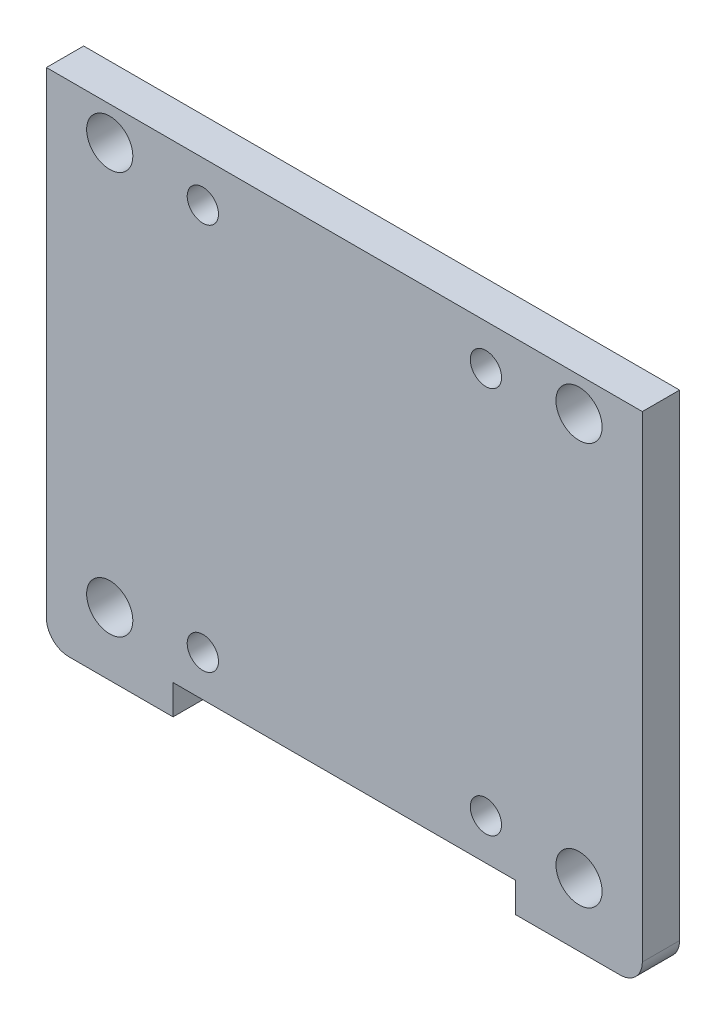
ISO-10303-21;
HEADER;
FILE_DESCRIPTION(('STEP AP214'),'2;1');
FILE_NAME('part.step','',(''),(''),'','','');
FILE_SCHEMA(('AUTOMOTIVE_DESIGN { 1 0 10303 214 1 1 1 1 }'));
ENDSEC;
DATA;
#1=APPLICATION_CONTEXT('core data for automotive mechanical design processes');
#2=APPLICATION_PROTOCOL_DEFINITION('international standard','automotive_design',2000,#1);
#3=PRODUCT_CONTEXT('',#1,'mechanical');
#4=PRODUCT('Part','Part','',(#3));
#5=PRODUCT_RELATED_PRODUCT_CATEGORY('part','',(#4));
#6=PRODUCT_DEFINITION_FORMATION('','',#4);
#7=PRODUCT_DEFINITION_CONTEXT('part definition',#1,'design');
#8=PRODUCT_DEFINITION('design','',#6,#7);
#9=PRODUCT_DEFINITION_SHAPE('','',#8);
#10=(LENGTH_UNIT() NAMED_UNIT(*) SI_UNIT(.MILLI.,.METRE.));
#11=(NAMED_UNIT(*) PLANE_ANGLE_UNIT() SI_UNIT($,.RADIAN.));
#12=(NAMED_UNIT(*) SI_UNIT($,.STERADIAN.) SOLID_ANGLE_UNIT());
#13=UNCERTAINTY_MEASURE_WITH_UNIT(LENGTH_MEASURE(1.E-05),#10,'distance_accuracy_value','');
#14=(GEOMETRIC_REPRESENTATION_CONTEXT(3) GLOBAL_UNCERTAINTY_ASSIGNED_CONTEXT((#13)) GLOBAL_UNIT_ASSIGNED_CONTEXT((#10,
#11,#12)) REPRESENTATION_CONTEXT('',''));
#15=CARTESIAN_POINT('',(0.,0.,0.));
#16=DIRECTION('',(0.,0.,1.));
#17=DIRECTION('',(1.,0.,0.));
#18=AXIS2_PLACEMENT_3D('',#15,#16,#17);
#19=CARTESIAN_POINT('',(-37.,-35.5,5.));
#20=DIRECTION('',(0.,1.,0.));
#21=DIRECTION('',(0.,0.,1.));
#22=AXIS2_PLACEMENT_3D('',#19,#20,#21);
#23=PLANE('',#22);
#24=DIRECTION('',(1.,0.,0.));
#25=VECTOR('',#24,1.);
#26=CARTESIAN_POINT('',(-37.,-35.5,5.));
#27=LINE('',#26,#25);
#28=CARTESIAN_POINT('',(23.,-35.5,5.));
#29=VERTEX_POINT('',#28);
#30=CARTESIAN_POINT('',(37.,-35.5,5.));
#31=VERTEX_POINT('',#30);
#32=EDGE_CURVE('E195',#29,#31,#27,.T.);
#33=ORIENTED_EDGE('',*,*,#32,.F.);
#34=DIRECTION('',(0.,0.,-1.));
#35=VECTOR('',#34,1.);
#36=CARTESIAN_POINT('',(23.,-35.5,5.));
#37=LINE('',#36,#35);
#38=CARTESIAN_POINT('',(23.,-35.5,0.));
#39=VERTEX_POINT('',#38);
#40=EDGE_CURVE('E209',#29,#39,#37,.T.);
#41=ORIENTED_EDGE('',*,*,#40,.T.);
#42=DIRECTION('',(1.,0.,0.));
#43=VECTOR('',#42,1.);
#44=CARTESIAN_POINT('',(-37.,-35.5,0.));
#45=LINE('',#44,#43);
#46=CARTESIAN_POINT('',(37.,-35.5,0.));
#47=VERTEX_POINT('',#46);
#48=EDGE_CURVE('E131',#39,#47,#45,.T.);
#49=ORIENTED_EDGE('',*,*,#48,.T.);
#50=DIRECTION('',(0.,0.,-1.));
#51=VECTOR('',#50,1.);
#52=CARTESIAN_POINT('',(37.,-35.5,5.));
#53=LINE('',#52,#51);
#54=EDGE_CURVE('E146',#31,#47,#53,.T.);
#55=ORIENTED_EDGE('',*,*,#54,.F.);
#56=EDGE_LOOP('',(#33,#41,#49,#55));
#57=FACE_BOUND('',#56,.T.);
#58=ADVANCED_FACE('F34',(#57),#23,.F.);
#59=CARTESIAN_POINT('',(37.,-32.5,5.));
#60=DIRECTION('',(0.,0.,-1.));
#61=DIRECTION('',(-1.,0.,0.));
#62=AXIS2_PLACEMENT_3D('',#59,#60,#61);
#63=CYLINDRICAL_SURFACE('',#62,3.);
#64=CARTESIAN_POINT('',(37.,-32.5,0.));
#65=DIRECTION('',(0.,0.,1.));
#66=DIRECTION('',(1.,0.,0.));
#67=AXIS2_PLACEMENT_3D('',#64,#65,#66);
#68=CIRCLE('',#67,3.);
#69=CARTESIAN_POINT('',(40.,-32.5,0.));
#70=VERTEX_POINT('',#69);
#71=EDGE_CURVE('E133',#47,#70,#68,.T.);
#72=ORIENTED_EDGE('',*,*,#71,.T.);
#73=DIRECTION('',(0.,0.,-1.));
#74=VECTOR('',#73,1.);
#75=CARTESIAN_POINT('',(40.,-32.5,5.));
#76=LINE('',#75,#74);
#77=CARTESIAN_POINT('',(40.,-32.5,5.));
#78=VERTEX_POINT('',#77);
#79=EDGE_CURVE('E42',#78,#70,#76,.T.);
#80=ORIENTED_EDGE('',*,*,#79,.F.);
#81=CARTESIAN_POINT('',(37.,-32.5,5.));
#82=DIRECTION('',(0.,0.,1.));
#83=DIRECTION('',(1.,0.,0.));
#84=AXIS2_PLACEMENT_3D('',#81,#82,#83);
#85=CIRCLE('',#84,3.);
#86=EDGE_CURVE('E141',#31,#78,#85,.T.);
#87=ORIENTED_EDGE('',*,*,#86,.F.);
#88=ORIENTED_EDGE('',*,*,#54,.T.);
#89=EDGE_LOOP('',(#72,#80,#87,#88));
#90=FACE_BOUND('',#89,.T.);
#91=ADVANCED_FACE('F36',(#90),#63,.T.);
#92=CARTESIAN_POINT('',(40.,-32.5,5.));
#93=DIRECTION('',(-1.,0.,0.));
#94=DIRECTION('',(0.,0.,1.));
#95=AXIS2_PLACEMENT_3D('',#92,#93,#94);
#96=PLANE('',#95);
#97=DIRECTION('',(0.,1.,0.));
#98=VECTOR('',#97,1.);
#99=CARTESIAN_POINT('',(40.,-32.5,0.));
#100=LINE('',#99,#98);
#101=CARTESIAN_POINT('',(40.,31.4999999999999,0.));
#102=VERTEX_POINT('',#101);
#103=EDGE_CURVE('E159',#70,#102,#100,.T.);
#104=ORIENTED_EDGE('',*,*,#103,.T.);
#105=DIRECTION('',(0.,0.,1.));
#106=VECTOR('',#105,1.);
#107=CARTESIAN_POINT('',(40.,31.5,0.));
#108=LINE('',#107,#106);
#109=CARTESIAN_POINT('',(40.,31.5,5.));
#110=VERTEX_POINT('',#109);
#111=EDGE_CURVE('E57',#102,#110,#108,.T.);
#112=ORIENTED_EDGE('',*,*,#111,.T.);
#113=DIRECTION('',(0.,1.,0.));
#114=VECTOR('',#113,1.);
#115=CARTESIAN_POINT('',(40.,-32.5,5.));
#116=LINE('',#115,#114);
#117=EDGE_CURVE('E161',#78,#110,#116,.T.);
#118=ORIENTED_EDGE('',*,*,#117,.F.);
#119=ORIENTED_EDGE('',*,*,#79,.T.);
#120=EDGE_LOOP('',(#104,#112,#118,#119));
#121=FACE_BOUND('',#120,.T.);
#122=ADVANCED_FACE('F158',(#121),#96,.F.);
#123=CARTESIAN_POINT('',(-40.,-32.5,5.));
#124=DIRECTION('',(1.,0.,0.));
#125=DIRECTION('',(0.,0.,-1.));
#126=AXIS2_PLACEMENT_3D('',#123,#124,#125);
#127=PLANE('',#126);
#128=DIRECTION('',(0.,-1.,0.));
#129=VECTOR('',#128,1.);
#130=CARTESIAN_POINT('',(-40.,-32.5,5.));
#131=LINE('',#130,#129);
#132=CARTESIAN_POINT('',(-40.,31.5,5.));
#133=VERTEX_POINT('',#132);
#134=CARTESIAN_POINT('',(-40.,-32.5,5.));
#135=VERTEX_POINT('',#134);
#136=EDGE_CURVE('E197',#133,#135,#131,.T.);
#137=ORIENTED_EDGE('',*,*,#136,.F.);
#138=DIRECTION('',(0.,0.,1.));
#139=VECTOR('',#138,1.);
#140=CARTESIAN_POINT('',(-40.,31.5,0.));
#141=LINE('',#140,#139);
#142=CARTESIAN_POINT('',(-40.,31.5,0.));
#143=VERTEX_POINT('',#142);
#144=EDGE_CURVE('E180',#143,#133,#141,.T.);
#145=ORIENTED_EDGE('',*,*,#144,.F.);
#146=DIRECTION('',(0.,-1.,0.));
#147=VECTOR('',#146,1.);
#148=CARTESIAN_POINT('',(-40.,-32.5,0.));
#149=LINE('',#148,#147);
#150=CARTESIAN_POINT('',(-40.,-32.5,0.));
#151=VERTEX_POINT('',#150);
#152=EDGE_CURVE('E142',#143,#151,#149,.T.);
#153=ORIENTED_EDGE('',*,*,#152,.T.);
#154=DIRECTION('',(0.,0.,-1.));
#155=VECTOR('',#154,1.);
#156=CARTESIAN_POINT('',(-40.,-32.5,5.));
#157=LINE('',#156,#155);
#158=EDGE_CURVE('E152',#135,#151,#157,.T.);
#159=ORIENTED_EDGE('',*,*,#158,.F.);
#160=EDGE_LOOP('',(#137,#145,#153,#159));
#161=FACE_BOUND('',#160,.T.);
#162=ADVANCED_FACE('F178',(#161),#127,.F.);
#163=CARTESIAN_POINT('',(-37.,-32.5,5.));
#164=DIRECTION('',(0.,0.,-1.));
#165=DIRECTION('',(-1.,0.,0.));
#166=AXIS2_PLACEMENT_3D('',#163,#164,#165);
#167=CYLINDRICAL_SURFACE('',#166,3.);
#168=CARTESIAN_POINT('',(-37.,-32.5,0.));
#169=DIRECTION('',(0.,0.,1.));
#170=DIRECTION('',(-1.,0.,0.));
#171=AXIS2_PLACEMENT_3D('',#168,#169,#170);
#172=CIRCLE('',#171,3.);
#173=CARTESIAN_POINT('',(-37.,-35.5,0.));
#174=VERTEX_POINT('',#173);
#175=EDGE_CURVE('E138',#151,#174,#172,.T.);
#176=ORIENTED_EDGE('',*,*,#175,.T.);
#177=DIRECTION('',(0.,0.,-1.));
#178=VECTOR('',#177,1.);
#179=CARTESIAN_POINT('',(-37.,-35.5,5.));
#180=LINE('',#179,#178);
#181=CARTESIAN_POINT('',(-37.,-35.5,5.));
#182=VERTEX_POINT('',#181);
#183=EDGE_CURVE('E148',#182,#174,#180,.T.);
#184=ORIENTED_EDGE('',*,*,#183,.F.);
#185=CARTESIAN_POINT('',(-37.,-32.5,5.));
#186=DIRECTION('',(0.,0.,1.));
#187=DIRECTION('',(-1.,0.,0.));
#188=AXIS2_PLACEMENT_3D('',#185,#186,#187);
#189=CIRCLE('',#188,3.);
#190=EDGE_CURVE('E185',#135,#182,#189,.T.);
#191=ORIENTED_EDGE('',*,*,#190,.F.);
#192=ORIENTED_EDGE('',*,*,#158,.T.);
#193=EDGE_LOOP('',(#176,#184,#191,#192));
#194=FACE_BOUND('',#193,.T.);
#195=ADVANCED_FACE('F183',(#194),#167,.T.);
#196=CARTESIAN_POINT('',(-23.,-35.5,0.));
#197=VERTEX_POINT('',#196);
#198=EDGE_CURVE('E137',#174,#197,#45,.T.);
#199=ORIENTED_EDGE('',*,*,#198,.T.);
#200=DIRECTION('',(0.,0.,1.));
#201=VECTOR('',#200,1.);
#202=CARTESIAN_POINT('',(-23.,-35.5,5.));
#203=LINE('',#202,#201);
#204=CARTESIAN_POINT('',(-23.,-35.5,5.));
#205=VERTEX_POINT('',#204);
#206=EDGE_CURVE('E191',#197,#205,#203,.T.);
#207=ORIENTED_EDGE('',*,*,#206,.T.);
#208=EDGE_CURVE('E149',#182,#205,#27,.T.);
#209=ORIENTED_EDGE('',*,*,#208,.F.);
#210=ORIENTED_EDGE('',*,*,#183,.T.);
#211=EDGE_LOOP('',(#199,#207,#209,#210));
#212=FACE_BOUND('',#211,.T.);
#213=ADVANCED_FACE('F189',(#212),#23,.F.);
#214=CARTESIAN_POINT('',(37.,-32.5,5.));
#215=DIRECTION('',(0.,0.,1.));
#216=DIRECTION('',(1.,0.,0.));
#217=AXIS2_PLACEMENT_3D('',#214,#215,#216);
#218=PLANE('',#217);
#219=CARTESIAN_POINT('',(19.,25.9999999999999,5.));
#220=DIRECTION('',(0.,0.,1.));
#221=DIRECTION('',(1.,0.,0.));
#222=AXIS2_PLACEMENT_3D('',#219,#220,#221);
#223=CIRCLE('',#222,2.1);
#224=CARTESIAN_POINT('',(21.1,25.9999999999999,5.));
#225=VERTEX_POINT('',#224);
#226=EDGE_CURVE('E244',#225,#225,#223,.T.);
#227=ORIENTED_EDGE('',*,*,#226,.F.);
#228=EDGE_LOOP('',(#227));
#229=FACE_BOUND('',#228,.T.);
#230=CARTESIAN_POINT('',(-19.,25.9999999999999,5.));
#231=DIRECTION('',(0.,0.,1.));
#232=DIRECTION('',(1.,0.,0.));
#233=AXIS2_PLACEMENT_3D('',#230,#231,#232);
#234=CIRCLE('',#233,2.1);
#235=CARTESIAN_POINT('',(-16.9,25.9999999999999,5.));
#236=VERTEX_POINT('',#235);
#237=EDGE_CURVE('E250',#236,#236,#234,.T.);
#238=ORIENTED_EDGE('',*,*,#237,.F.);
#239=EDGE_LOOP('',(#238));
#240=FACE_BOUND('',#239,.T.);
#241=CARTESIAN_POINT('',(-19.,-26.,5.));
#242=DIRECTION('',(0.,0.,1.));
#243=DIRECTION('',(1.,0.,0.));
#244=AXIS2_PLACEMENT_3D('',#241,#242,#243);
#245=CIRCLE('',#244,2.1);
#246=CARTESIAN_POINT('',(-16.9,-26.,5.));
#247=VERTEX_POINT('',#246);
#248=EDGE_CURVE('E256',#247,#247,#245,.T.);
#249=ORIENTED_EDGE('',*,*,#248,.F.);
#250=EDGE_LOOP('',(#249));
#251=FACE_BOUND('',#250,.T.);
#252=CARTESIAN_POINT('',(19.,-26.,5.));
#253=DIRECTION('',(0.,0.,1.));
#254=DIRECTION('',(1.,0.,0.));
#255=AXIS2_PLACEMENT_3D('',#252,#253,#254);
#256=CIRCLE('',#255,2.1);
#257=CARTESIAN_POINT('',(21.1,-26.,5.));
#258=VERTEX_POINT('',#257);
#259=EDGE_CURVE('E238',#258,#258,#256,.T.);
#260=ORIENTED_EDGE('',*,*,#259,.F.);
#261=EDGE_LOOP('',(#260));
#262=FACE_BOUND('',#261,.T.);
#263=DIRECTION('',(0.,1.,0.));
#264=VECTOR('',#263,1.);
#265=CARTESIAN_POINT('',(23.,-39.5,5.));
#266=LINE('',#265,#264);
#267=CARTESIAN_POINT('',(23.,-31.5,5.));
#268=VERTEX_POINT('',#267);
#269=EDGE_CURVE('E115',#29,#268,#266,.T.);
#270=ORIENTED_EDGE('',*,*,#269,.F.);
#271=ORIENTED_EDGE('',*,*,#32,.T.);
#272=ORIENTED_EDGE('',*,*,#86,.T.);
#273=ORIENTED_EDGE('',*,*,#117,.T.);
#274=DIRECTION('',(1.,0.,0.));
#275=VECTOR('',#274,1.);
#276=CARTESIAN_POINT('',(-40.,31.5,5.));
#277=LINE('',#276,#275);
#278=EDGE_CURVE('E228',#133,#110,#277,.T.);
#279=ORIENTED_EDGE('',*,*,#278,.F.);
#280=ORIENTED_EDGE('',*,*,#136,.T.);
#281=ORIENTED_EDGE('',*,*,#190,.T.);
#282=ORIENTED_EDGE('',*,*,#208,.T.);
#283=DIRECTION('',(0.,-1.,0.));
#284=VECTOR('',#283,1.);
#285=CARTESIAN_POINT('',(-23.,-39.5,5.));
#286=LINE('',#285,#284);
#287=CARTESIAN_POINT('',(-23.,-31.5,5.));
#288=VERTEX_POINT('',#287);
#289=EDGE_CURVE('E125',#288,#205,#286,.T.);
#290=ORIENTED_EDGE('',*,*,#289,.F.);
#291=DIRECTION('',(-1.,0.,0.));
#292=VECTOR('',#291,1.);
#293=CARTESIAN_POINT('',(-23.,-31.5,5.));
#294=LINE('',#293,#292);
#295=EDGE_CURVE('E234',#268,#288,#294,.T.);
#296=ORIENTED_EDGE('',*,*,#295,.F.);
#297=EDGE_LOOP('',(#270,#271,#272,#273,#279,#280,#281,#282,#290,#296));
#298=FACE_BOUND('',#297,.T.);
#299=CARTESIAN_POINT('',(-31.5,-27.,5.));
#300=DIRECTION('',(0.,0.,1.));
#301=DIRECTION('',(1.,0.,0.));
#302=AXIS2_PLACEMENT_3D('',#299,#300,#301);
#303=CIRCLE('',#302,3.1);
#304=CARTESIAN_POINT('',(-28.4,-27.,5.));
#305=VERTEX_POINT('',#304);
#306=EDGE_CURVE('E205',#305,#305,#303,.T.);
#307=ORIENTED_EDGE('',*,*,#306,.F.);
#308=EDGE_LOOP('',(#307));
#309=FACE_BOUND('',#308,.T.);
#310=CARTESIAN_POINT('',(31.5,-27.,5.));
#311=DIRECTION('',(0.,0.,1.));
#312=DIRECTION('',(1.,0.,0.));
#313=AXIS2_PLACEMENT_3D('',#310,#311,#312);
#314=CIRCLE('',#313,3.1);
#315=CARTESIAN_POINT('',(34.6,-27.,5.));
#316=VERTEX_POINT('',#315);
#317=EDGE_CURVE('E212',#316,#316,#314,.T.);
#318=ORIENTED_EDGE('',*,*,#317,.F.);
#319=EDGE_LOOP('',(#318));
#320=FACE_BOUND('',#319,.T.);
#321=CARTESIAN_POINT('',(31.5,27.,5.));
#322=DIRECTION('',(0.,0.,1.));
#323=DIRECTION('',(1.,0.,0.));
#324=AXIS2_PLACEMENT_3D('',#321,#322,#323);
#325=CIRCLE('',#324,3.1);
#326=CARTESIAN_POINT('',(34.6,27.,5.));
#327=VERTEX_POINT('',#326);
#328=EDGE_CURVE('E218',#327,#327,#325,.T.);
#329=ORIENTED_EDGE('',*,*,#328,.F.);
#330=EDGE_LOOP('',(#329));
#331=FACE_BOUND('',#330,.T.);
#332=CARTESIAN_POINT('',(-31.5,27.,5.));
#333=DIRECTION('',(0.,0.,1.));
#334=DIRECTION('',(1.,0.,0.));
#335=AXIS2_PLACEMENT_3D('',#332,#333,#334);
#336=CIRCLE('',#335,3.1);
#337=CARTESIAN_POINT('',(-28.4,27.,5.));
#338=VERTEX_POINT('',#337);
#339=EDGE_CURVE('E169',#338,#338,#336,.T.);
#340=ORIENTED_EDGE('',*,*,#339,.F.);
#341=EDGE_LOOP('',(#340));
#342=FACE_BOUND('',#341,.T.);
#343=ADVANCED_FACE('F272',(#229,#240,#251,#262,#298,#309,#320,#331,#342),#218,.T.);
#344=CARTESIAN_POINT('',(37.,-32.5,0.));
#345=DIRECTION('',(0.,0.,1.));
#346=DIRECTION('',(1.,0.,0.));
#347=AXIS2_PLACEMENT_3D('',#344,#345,#346);
#348=PLANE('',#347);
#349=CARTESIAN_POINT('',(19.,25.9999999999999,0.));
#350=DIRECTION('',(0.,0.,1.));
#351=DIRECTION('',(1.,0.,0.));
#352=AXIS2_PLACEMENT_3D('',#349,#350,#351);
#353=CIRCLE('',#352,2.1);
#354=CARTESIAN_POINT('',(21.1,25.9999999999999,0.));
#355=VERTEX_POINT('',#354);
#356=EDGE_CURVE('E247',#355,#355,#353,.T.);
#357=ORIENTED_EDGE('',*,*,#356,.T.);
#358=EDGE_LOOP('',(#357));
#359=FACE_BOUND('',#358,.T.);
#360=CARTESIAN_POINT('',(-19.,25.9999999999999,0.));
#361=DIRECTION('',(0.,0.,1.));
#362=DIRECTION('',(1.,0.,0.));
#363=AXIS2_PLACEMENT_3D('',#360,#361,#362);
#364=CIRCLE('',#363,2.1);
#365=CARTESIAN_POINT('',(-16.9,25.9999999999999,0.));
#366=VERTEX_POINT('',#365);
#367=EDGE_CURVE('E253',#366,#366,#364,.T.);
#368=ORIENTED_EDGE('',*,*,#367,.T.);
#369=EDGE_LOOP('',(#368));
#370=FACE_BOUND('',#369,.T.);
#371=CARTESIAN_POINT('',(-19.,-26.,0.));
#372=DIRECTION('',(0.,0.,1.));
#373=DIRECTION('',(1.,0.,0.));
#374=AXIS2_PLACEMENT_3D('',#371,#372,#373);
#375=CIRCLE('',#374,2.1);
#376=CARTESIAN_POINT('',(-16.9,-26.,0.));
#377=VERTEX_POINT('',#376);
#378=EDGE_CURVE('E241',#377,#377,#375,.T.);
#379=ORIENTED_EDGE('',*,*,#378,.T.);
#380=EDGE_LOOP('',(#379));
#381=FACE_BOUND('',#380,.T.);
#382=CARTESIAN_POINT('',(19.,-26.,0.));
#383=DIRECTION('',(0.,0.,1.));
#384=DIRECTION('',(1.,0.,0.));
#385=AXIS2_PLACEMENT_3D('',#382,#383,#384);
#386=CIRCLE('',#385,2.1);
#387=CARTESIAN_POINT('',(21.1,-26.,0.));
#388=VERTEX_POINT('',#387);
#389=EDGE_CURVE('E230',#388,#388,#386,.T.);
#390=ORIENTED_EDGE('',*,*,#389,.T.);
#391=EDGE_LOOP('',(#390));
#392=FACE_BOUND('',#391,.T.);
#393=ORIENTED_EDGE('',*,*,#48,.F.);
#394=DIRECTION('',(0.,1.,0.));
#395=VECTOR('',#394,1.);
#396=CARTESIAN_POINT('',(23.,-32.5,0.));
#397=LINE('',#396,#395);
#398=CARTESIAN_POINT('',(23.,-31.5,0.));
#399=VERTEX_POINT('',#398);
#400=EDGE_CURVE('E11',#39,#399,#397,.T.);
#401=ORIENTED_EDGE('',*,*,#400,.T.);
#402=DIRECTION('',(-1.,0.,0.));
#403=VECTOR('',#402,1.);
#404=CARTESIAN_POINT('',(-23.,-31.5,0.));
#405=LINE('',#404,#403);
#406=CARTESIAN_POINT('',(-23.,-31.5,0.));
#407=VERTEX_POINT('',#406);
#408=EDGE_CURVE('E122',#399,#407,#405,.T.);
#409=ORIENTED_EDGE('',*,*,#408,.T.);
#410=DIRECTION('',(0.,-1.,0.));
#411=VECTOR('',#410,1.);
#412=CARTESIAN_POINT('',(-23.,-39.5,0.));
#413=LINE('',#412,#411);
#414=EDGE_CURVE('E49',#407,#197,#413,.T.);
#415=ORIENTED_EDGE('',*,*,#414,.T.);
#416=ORIENTED_EDGE('',*,*,#198,.F.);
#417=ORIENTED_EDGE('',*,*,#175,.F.);
#418=ORIENTED_EDGE('',*,*,#152,.F.);
#419=DIRECTION('',(1.,0.,0.));
#420=VECTOR('',#419,1.);
#421=CARTESIAN_POINT('',(-40.,31.5,0.));
#422=LINE('',#421,#420);
#423=EDGE_CURVE('E226',#143,#102,#422,.T.);
#424=ORIENTED_EDGE('',*,*,#423,.T.);
#425=ORIENTED_EDGE('',*,*,#103,.F.);
#426=ORIENTED_EDGE('',*,*,#71,.F.);
#427=EDGE_LOOP('',(#393,#401,#409,#415,#416,#417,#418,#424,#425,#426));
#428=FACE_BOUND('',#427,.T.);
#429=CARTESIAN_POINT('',(-31.5,-27.,0.));
#430=DIRECTION('',(0.,0.,1.));
#431=DIRECTION('',(1.,0.,0.));
#432=AXIS2_PLACEMENT_3D('',#429,#430,#431);
#433=CIRCLE('',#432,3.1);
#434=CARTESIAN_POINT('',(-28.4,-27.,0.));
#435=VERTEX_POINT('',#434);
#436=EDGE_CURVE('E208',#435,#435,#433,.T.);
#437=ORIENTED_EDGE('',*,*,#436,.T.);
#438=EDGE_LOOP('',(#437));
#439=FACE_BOUND('',#438,.T.);
#440=CARTESIAN_POINT('',(31.5,-27.,0.));
#441=DIRECTION('',(0.,0.,1.));
#442=DIRECTION('',(1.,0.,0.));
#443=AXIS2_PLACEMENT_3D('',#440,#441,#442);
#444=CIRCLE('',#443,3.1);
#445=CARTESIAN_POINT('',(34.6,-27.,0.));
#446=VERTEX_POINT('',#445);
#447=EDGE_CURVE('E215',#446,#446,#444,.T.);
#448=ORIENTED_EDGE('',*,*,#447,.T.);
#449=EDGE_LOOP('',(#448));
#450=FACE_BOUND('',#449,.T.);
#451=CARTESIAN_POINT('',(31.5,27.,0.));
#452=DIRECTION('',(0.,0.,1.));
#453=DIRECTION('',(1.,0.,0.));
#454=AXIS2_PLACEMENT_3D('',#451,#452,#453);
#455=CIRCLE('',#454,3.1);
#456=CARTESIAN_POINT('',(34.6,27.,0.));
#457=VERTEX_POINT('',#456);
#458=EDGE_CURVE('E203',#457,#457,#455,.T.);
#459=ORIENTED_EDGE('',*,*,#458,.T.);
#460=EDGE_LOOP('',(#459));
#461=FACE_BOUND('',#460,.T.);
#462=CARTESIAN_POINT('',(-31.5,27.,0.));
#463=DIRECTION('',(0.,0.,1.));
#464=DIRECTION('',(1.,0.,0.));
#465=AXIS2_PLACEMENT_3D('',#462,#463,#464);
#466=CIRCLE('',#465,3.1);
#467=CARTESIAN_POINT('',(-28.4,27.,0.));
#468=VERTEX_POINT('',#467);
#469=EDGE_CURVE('E165',#468,#468,#466,.T.);
#470=ORIENTED_EDGE('',*,*,#469,.T.);
#471=EDGE_LOOP('',(#470));
#472=FACE_BOUND('',#471,.T.);
#473=ADVANCED_FACE('F128',(#359,#370,#381,#392,#428,#439,#450,#461,#472),#348,.F.);
#474=CARTESIAN_POINT('',(-31.5,27.,0.));
#475=DIRECTION('',(0.,0.,1.));
#476=DIRECTION('',(1.,0.,0.));
#477=AXIS2_PLACEMENT_3D('',#474,#475,#476);
#478=CYLINDRICAL_SURFACE('',#477,3.1);
#479=ORIENTED_EDGE('',*,*,#469,.F.);
#480=EDGE_LOOP('',(#479));
#481=FACE_BOUND('',#480,.T.);
#482=ORIENTED_EDGE('',*,*,#339,.T.);
#483=EDGE_LOOP('',(#482));
#484=FACE_BOUND('',#483,.T.);
#485=ADVANCED_FACE('F287',(#481,#484),#478,.F.);
#486=CARTESIAN_POINT('',(31.5,27.,0.));
#487=DIRECTION('',(0.,0.,1.));
#488=DIRECTION('',(1.,0.,0.));
#489=AXIS2_PLACEMENT_3D('',#486,#487,#488);
#490=CYLINDRICAL_SURFACE('',#489,3.1);
#491=ORIENTED_EDGE('',*,*,#458,.F.);
#492=EDGE_LOOP('',(#491));
#493=FACE_BOUND('',#492,.T.);
#494=ORIENTED_EDGE('',*,*,#328,.T.);
#495=EDGE_LOOP('',(#494));
#496=FACE_BOUND('',#495,.T.);
#497=ADVANCED_FACE('F289',(#493,#496),#490,.F.);
#498=CARTESIAN_POINT('',(31.5,-27.,0.));
#499=DIRECTION('',(0.,0.,1.));
#500=DIRECTION('',(1.,0.,0.));
#501=AXIS2_PLACEMENT_3D('',#498,#499,#500);
#502=CYLINDRICAL_SURFACE('',#501,3.1);
#503=ORIENTED_EDGE('',*,*,#447,.F.);
#504=EDGE_LOOP('',(#503));
#505=FACE_BOUND('',#504,.T.);
#506=ORIENTED_EDGE('',*,*,#317,.T.);
#507=EDGE_LOOP('',(#506));
#508=FACE_BOUND('',#507,.T.);
#509=ADVANCED_FACE('F296',(#505,#508),#502,.F.);
#510=CARTESIAN_POINT('',(-31.5,-27.,0.));
#511=DIRECTION('',(0.,0.,1.));
#512=DIRECTION('',(1.,0.,0.));
#513=AXIS2_PLACEMENT_3D('',#510,#511,#512);
#514=CYLINDRICAL_SURFACE('',#513,3.1);
#515=ORIENTED_EDGE('',*,*,#436,.F.);
#516=EDGE_LOOP('',(#515));
#517=FACE_BOUND('',#516,.T.);
#518=ORIENTED_EDGE('',*,*,#306,.T.);
#519=EDGE_LOOP('',(#518));
#520=FACE_BOUND('',#519,.T.);
#521=ADVANCED_FACE('F342',(#517,#520),#514,.F.);
#522=CARTESIAN_POINT('',(-40.,31.5,0.));
#523=DIRECTION('',(0.,-1.,0.));
#524=DIRECTION('',(0.,0.,-1.));
#525=AXIS2_PLACEMENT_3D('',#522,#523,#524);
#526=PLANE('',#525);
#527=ORIENTED_EDGE('',*,*,#278,.T.);
#528=ORIENTED_EDGE('',*,*,#111,.F.);
#529=ORIENTED_EDGE('',*,*,#423,.F.);
#530=ORIENTED_EDGE('',*,*,#144,.T.);
#531=EDGE_LOOP('',(#527,#528,#529,#530));
#532=FACE_BOUND('',#531,.T.);
#533=ADVANCED_FACE('F337',(#532),#526,.F.);
#534=CARTESIAN_POINT('',(23.,-39.5,0.));
#535=DIRECTION('',(1.,0.,0.));
#536=DIRECTION('',(0.,0.,-1.));
#537=AXIS2_PLACEMENT_3D('',#534,#535,#536);
#538=PLANE('',#537);
#539=ORIENTED_EDGE('',*,*,#269,.T.);
#540=DIRECTION('',(0.,0.,1.));
#541=VECTOR('',#540,1.);
#542=CARTESIAN_POINT('',(23.,-31.5,0.));
#543=LINE('',#542,#541);
#544=EDGE_CURVE('E110',#399,#268,#543,.T.);
#545=ORIENTED_EDGE('',*,*,#544,.F.);
#546=ORIENTED_EDGE('',*,*,#400,.F.);
#547=ORIENTED_EDGE('',*,*,#40,.F.);
#548=EDGE_LOOP('',(#539,#545,#546,#547));
#549=FACE_BOUND('',#548,.T.);
#550=ADVANCED_FACE('F112',(#549),#538,.F.);
#551=CARTESIAN_POINT('',(-23.,-39.5,0.));
#552=DIRECTION('',(-1.,0.,0.));
#553=DIRECTION('',(0.,0.,1.));
#554=AXIS2_PLACEMENT_3D('',#551,#552,#553);
#555=PLANE('',#554);
#556=ORIENTED_EDGE('',*,*,#414,.F.);
#557=DIRECTION('',(0.,0.,1.));
#558=VECTOR('',#557,1.);
#559=CARTESIAN_POINT('',(-23.,-31.5,0.));
#560=LINE('',#559,#558);
#561=EDGE_CURVE('E119',#407,#288,#560,.T.);
#562=ORIENTED_EDGE('',*,*,#561,.T.);
#563=ORIENTED_EDGE('',*,*,#289,.T.);
#564=ORIENTED_EDGE('',*,*,#206,.F.);
#565=EDGE_LOOP('',(#556,#562,#563,#564));
#566=FACE_BOUND('',#565,.T.);
#567=ADVANCED_FACE('F353',(#566),#555,.F.);
#568=CARTESIAN_POINT('',(-23.,-31.5,0.));
#569=DIRECTION('',(0.,1.,0.));
#570=DIRECTION('',(0.,0.,1.));
#571=AXIS2_PLACEMENT_3D('',#568,#569,#570);
#572=PLANE('',#571);
#573=ORIENTED_EDGE('',*,*,#295,.T.);
#574=ORIENTED_EDGE('',*,*,#561,.F.);
#575=ORIENTED_EDGE('',*,*,#408,.F.);
#576=ORIENTED_EDGE('',*,*,#544,.T.);
#577=EDGE_LOOP('',(#573,#574,#575,#576));
#578=FACE_BOUND('',#577,.T.);
#579=ADVANCED_FACE('F123',(#578),#572,.F.);
#580=CARTESIAN_POINT('',(19.,-26.,0.));
#581=DIRECTION('',(0.,0.,1.));
#582=DIRECTION('',(1.,0.,0.));
#583=AXIS2_PLACEMENT_3D('',#580,#581,#582);
#584=CYLINDRICAL_SURFACE('',#583,2.1);
#585=ORIENTED_EDGE('',*,*,#389,.F.);
#586=EDGE_LOOP('',(#585));
#587=FACE_BOUND('',#586,.T.);
#588=ORIENTED_EDGE('',*,*,#259,.T.);
#589=EDGE_LOOP('',(#588));
#590=FACE_BOUND('',#589,.T.);
#591=ADVANCED_FACE('F268',(#587,#590),#584,.F.);
#592=CARTESIAN_POINT('',(-19.,-26.,0.));
#593=DIRECTION('',(0.,0.,1.));
#594=DIRECTION('',(1.,0.,0.));
#595=AXIS2_PLACEMENT_3D('',#592,#593,#594);
#596=CYLINDRICAL_SURFACE('',#595,2.1);
#597=ORIENTED_EDGE('',*,*,#378,.F.);
#598=EDGE_LOOP('',(#597));
#599=FACE_BOUND('',#598,.T.);
#600=ORIENTED_EDGE('',*,*,#248,.T.);
#601=EDGE_LOOP('',(#600));
#602=FACE_BOUND('',#601,.T.);
#603=ADVANCED_FACE('F264',(#599,#602),#596,.F.);
#604=CARTESIAN_POINT('',(-19.,25.9999999999999,0.));
#605=DIRECTION('',(0.,0.,1.));
#606=DIRECTION('',(1.,0.,0.));
#607=AXIS2_PLACEMENT_3D('',#604,#605,#606);
#608=CYLINDRICAL_SURFACE('',#607,2.1);
#609=ORIENTED_EDGE('',*,*,#367,.F.);
#610=EDGE_LOOP('',(#609));
#611=FACE_BOUND('',#610,.T.);
#612=ORIENTED_EDGE('',*,*,#237,.T.);
#613=EDGE_LOOP('',(#612));
#614=FACE_BOUND('',#613,.T.);
#615=ADVANCED_FACE('F267',(#611,#614),#608,.F.);
#616=CARTESIAN_POINT('',(19.,25.9999999999999,0.));
#617=DIRECTION('',(0.,0.,1.));
#618=DIRECTION('',(1.,0.,0.));
#619=AXIS2_PLACEMENT_3D('',#616,#617,#618);
#620=CYLINDRICAL_SURFACE('',#619,2.1);
#621=ORIENTED_EDGE('',*,*,#356,.F.);
#622=EDGE_LOOP('',(#621));
#623=FACE_BOUND('',#622,.T.);
#624=ORIENTED_EDGE('',*,*,#226,.T.);
#625=EDGE_LOOP('',(#624));
#626=FACE_BOUND('',#625,.T.);
#627=ADVANCED_FACE('F405',(#623,#626),#620,.F.);
#628=CLOSED_SHELL('',(#58,#91,#122,#162,#195,#213,#343,#473,#485,#497,#509,#521,#533,#550,#567,
#579,#591,#603,#615,#627));
#629=MANIFOLD_SOLID_BREP('B2',#628);
#630=ADVANCED_BREP_SHAPE_REPRESENTATION('',(#18,#629),#14);
#631=SHAPE_DEFINITION_REPRESENTATION(#9,#630);
ENDSEC;
END-ISO-10303-21;
